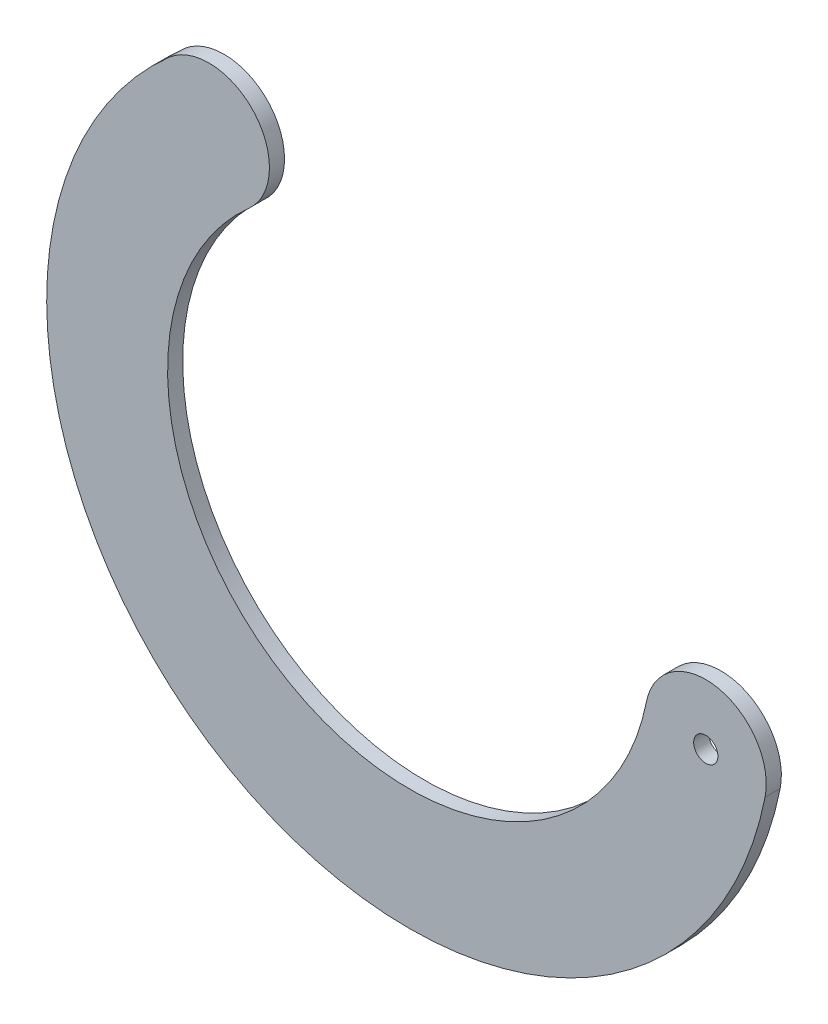
ISO-10303-21;
HEADER;
FILE_DESCRIPTION(('STEP AP214'),'2;1');
FILE_NAME('part.step','',(''),(''),'','','');
FILE_SCHEMA(('AUTOMOTIVE_DESIGN { 1 0 10303 214 1 1 1 1 }'));
ENDSEC;
DATA;
#1=APPLICATION_CONTEXT('core data for automotive mechanical design processes');
#2=APPLICATION_PROTOCOL_DEFINITION('international standard','automotive_design',2000,#1);
#3=PRODUCT_CONTEXT('',#1,'mechanical');
#4=PRODUCT('Part','Part','',(#3));
#5=PRODUCT_RELATED_PRODUCT_CATEGORY('part','',(#4));
#6=PRODUCT_DEFINITION_FORMATION('','',#4);
#7=PRODUCT_DEFINITION_CONTEXT('part definition',#1,'design');
#8=PRODUCT_DEFINITION('design','',#6,#7);
#9=PRODUCT_DEFINITION_SHAPE('','',#8);
#10=(LENGTH_UNIT() NAMED_UNIT(*) SI_UNIT(.MILLI.,.METRE.));
#11=(NAMED_UNIT(*) PLANE_ANGLE_UNIT() SI_UNIT($,.RADIAN.));
#12=(NAMED_UNIT(*) SI_UNIT($,.STERADIAN.) SOLID_ANGLE_UNIT());
#13=UNCERTAINTY_MEASURE_WITH_UNIT(LENGTH_MEASURE(1.E-05),#10,'distance_accuracy_value','');
#14=(GEOMETRIC_REPRESENTATION_CONTEXT(3) GLOBAL_UNCERTAINTY_ASSIGNED_CONTEXT((#13)) GLOBAL_UNIT_ASSIGNED_CONTEXT((#10,
#11,#12)) REPRESENTATION_CONTEXT('',''));
#15=CARTESIAN_POINT('',(0.,0.,0.));
#16=DIRECTION('',(0.,0.,1.));
#17=DIRECTION('',(1.,0.,0.));
#18=AXIS2_PLACEMENT_3D('',#15,#16,#17);
#19=CARTESIAN_POINT('',(-42.1070423614083,47.531536726415,3.175));
#20=DIRECTION('',(0.,0.,-1.));
#21=DIRECTION('',(-1.,0.,0.));
#22=AXIS2_PLACEMENT_3D('',#19,#20,#21);
#23=CYLINDRICAL_SURFACE('',#22,12.7);
#24=CARTESIAN_POINT('',(-42.1070423614083,47.531536726415,0.));
#25=DIRECTION('',(0.,0.,1.));
#26=DIRECTION('',(-1.,0.,0.));
#27=AXIS2_PLACEMENT_3D('',#24,#25,#26);
#28=CIRCLE('',#27,12.7);
#29=CARTESIAN_POINT('',(-33.6856338891268,38.0252293811322,0.));
#30=VERTEX_POINT('',#29);
#31=CARTESIAN_POINT('',(-50.5284508336901,57.0378440716983,0.));
#32=VERTEX_POINT('',#31);
#33=EDGE_CURVE('E106',#30,#32,#28,.T.);
#34=ORIENTED_EDGE('',*,*,#33,.T.);
#35=DIRECTION('',(0.,0.,-1.));
#36=VECTOR('',#35,1.);
#37=CARTESIAN_POINT('',(-50.5284508336901,57.0378440716983,3.175));
#38=LINE('',#37,#36);
#39=CARTESIAN_POINT('',(-50.5284508336901,57.0378440716983,3.175));
#40=VERTEX_POINT('',#39);
#41=EDGE_CURVE('E11',#40,#32,#38,.T.);
#42=ORIENTED_EDGE('',*,*,#41,.F.);
#43=CARTESIAN_POINT('',(-42.1070423614083,47.531536726415,3.175));
#44=DIRECTION('',(0.,0.,1.));
#45=DIRECTION('',(-1.,0.,0.));
#46=AXIS2_PLACEMENT_3D('',#43,#44,#45);
#47=CIRCLE('',#46,12.7);
#48=CARTESIAN_POINT('',(-33.6856338891268,38.0252293811322,3.175));
#49=VERTEX_POINT('',#48);
#50=EDGE_CURVE('E94',#49,#40,#47,.T.);
#51=ORIENTED_EDGE('',*,*,#50,.F.);
#52=DIRECTION('',(0.,0.,-1.));
#53=VECTOR('',#52,1.);
#54=CARTESIAN_POINT('',(-33.6856338891268,38.0252293811322,3.175));
#55=LINE('',#54,#53);
#56=EDGE_CURVE('E102',#49,#30,#55,.T.);
#57=ORIENTED_EDGE('',*,*,#56,.T.);
#58=EDGE_LOOP('',(#34,#42,#51,#57));
#59=FACE_BOUND('',#58,.T.);
#60=ADVANCED_FACE('F43',(#59),#23,.T.);
#61=CARTESIAN_POINT('',(0.,0.,3.175));
#62=DIRECTION('',(0.,0.,-1.));
#63=DIRECTION('',(-1.,0.,0.));
#64=AXIS2_PLACEMENT_3D('',#61,#62,#63);
#65=CYLINDRICAL_SURFACE('',#64,76.2);
#66=CARTESIAN_POINT('',(0.,0.,0.));
#67=DIRECTION('',(0.,0.,1.));
#68=DIRECTION('',(1.,0.,0.));
#69=AXIS2_PLACEMENT_3D('',#66,#67,#68);
#70=CIRCLE('',#69,76.2);
#71=CARTESIAN_POINT('',(74.7202474876482,-14.9440494975296,0.));
#72=VERTEX_POINT('',#71);
#73=EDGE_CURVE('E98',#32,#72,#70,.T.);
#74=ORIENTED_EDGE('',*,*,#73,.T.);
#75=DIRECTION('',(0.,0.,-1.));
#76=VECTOR('',#75,1.);
#77=CARTESIAN_POINT('',(74.7202474876482,-14.9440494975296,3.175));
#78=LINE('',#77,#76);
#79=CARTESIAN_POINT('',(74.7202474876482,-14.9440494975296,3.175));
#80=VERTEX_POINT('',#79);
#81=EDGE_CURVE('E51',#80,#72,#78,.T.);
#82=ORIENTED_EDGE('',*,*,#81,.F.);
#83=CARTESIAN_POINT('',(0.,0.,3.175));
#84=DIRECTION('',(0.,0.,1.));
#85=DIRECTION('',(1.,0.,0.));
#86=AXIS2_PLACEMENT_3D('',#83,#84,#85);
#87=CIRCLE('',#86,76.2);
#88=EDGE_CURVE('E89',#40,#80,#87,.T.);
#89=ORIENTED_EDGE('',*,*,#88,.F.);
#90=ORIENTED_EDGE('',*,*,#41,.T.);
#91=EDGE_LOOP('',(#74,#82,#89,#90));
#92=FACE_BOUND('',#91,.T.);
#93=ADVANCED_FACE('F97',(#92),#65,.T.);
#94=CARTESIAN_POINT('',(62.2668729063735,-12.4533745812747,3.175));
#95=DIRECTION('',(0.,0.,-1.));
#96=DIRECTION('',(-1.,0.,0.));
#97=AXIS2_PLACEMENT_3D('',#94,#95,#96);
#98=CYLINDRICAL_SURFACE('',#97,12.7);
#99=CARTESIAN_POINT('',(62.2668729063735,-12.4533745812747,0.));
#100=DIRECTION('',(0.,0.,1.));
#101=DIRECTION('',(-1.,0.,0.));
#102=AXIS2_PLACEMENT_3D('',#99,#100,#101);
#103=CIRCLE('',#102,12.7);
#104=CARTESIAN_POINT('',(49.8134983250988,-9.96269966501976,0.));
#105=VERTEX_POINT('',#104);
#106=EDGE_CURVE('E76',#72,#105,#103,.T.);
#107=ORIENTED_EDGE('',*,*,#106,.T.);
#108=DIRECTION('',(0.,0.,-1.));
#109=VECTOR('',#108,1.);
#110=CARTESIAN_POINT('',(49.8134983250988,-9.96269966501976,3.175));
#111=LINE('',#110,#109);
#112=CARTESIAN_POINT('',(49.8134983250988,-9.96269966501976,3.175));
#113=VERTEX_POINT('',#112);
#114=EDGE_CURVE('E99',#113,#105,#111,.T.);
#115=ORIENTED_EDGE('',*,*,#114,.F.);
#116=CARTESIAN_POINT('',(62.2668729063735,-12.4533745812747,3.175));
#117=DIRECTION('',(0.,0.,1.));
#118=DIRECTION('',(-1.,0.,0.));
#119=AXIS2_PLACEMENT_3D('',#116,#117,#118);
#120=CIRCLE('',#119,12.7);
#121=EDGE_CURVE('E92',#80,#113,#120,.T.);
#122=ORIENTED_EDGE('',*,*,#121,.F.);
#123=ORIENTED_EDGE('',*,*,#81,.T.);
#124=EDGE_LOOP('',(#107,#115,#122,#123));
#125=FACE_BOUND('',#124,.T.);
#126=ADVANCED_FACE('F100',(#125),#98,.T.);
#127=CARTESIAN_POINT('',(0.,0.,3.175));
#128=DIRECTION('',(0.,0.,-1.));
#129=DIRECTION('',(-1.,0.,0.));
#130=AXIS2_PLACEMENT_3D('',#127,#128,#129);
#131=CYLINDRICAL_SURFACE('',#130,50.8000000000001);
#132=CARTESIAN_POINT('',(0.,0.,0.));
#133=DIRECTION('',(0.,0.,-1.));
#134=DIRECTION('',(1.,0.,0.));
#135=AXIS2_PLACEMENT_3D('',#132,#133,#134);
#136=CIRCLE('',#135,50.8000000000001);
#137=EDGE_CURVE('E82',#105,#30,#136,.T.);
#138=ORIENTED_EDGE('',*,*,#137,.T.);
#139=ORIENTED_EDGE('',*,*,#56,.F.);
#140=CARTESIAN_POINT('',(0.,0.,3.175));
#141=DIRECTION('',(0.,0.,-1.));
#142=DIRECTION('',(1.,0.,0.));
#143=AXIS2_PLACEMENT_3D('',#140,#141,#142);
#144=CIRCLE('',#143,50.8000000000001);
#145=EDGE_CURVE('E59',#113,#49,#144,.T.);
#146=ORIENTED_EDGE('',*,*,#145,.F.);
#147=ORIENTED_EDGE('',*,*,#114,.T.);
#148=EDGE_LOOP('',(#138,#139,#146,#147));
#149=FACE_BOUND('',#148,.T.);
#150=ADVANCED_FACE('F114',(#149),#131,.F.);
#151=CARTESIAN_POINT('',(-21.0535211807041,23.7657683632075,3.175));
#152=DIRECTION('',(0.,0.,-1.));
#153=DIRECTION('',(-1.,0.,0.));
#154=AXIS2_PLACEMENT_3D('',#151,#152,#153);
#155=PLANE('',#154);
#156=CARTESIAN_POINT('',(62.2668729063735,-12.4533745812747,3.175));
#157=DIRECTION('',(0.,0.,1.));
#158=DIRECTION('',(1.,0.,0.));
#159=AXIS2_PLACEMENT_3D('',#156,#157,#158);
#160=CIRCLE('',#159,2.55269999999999);
#161=CARTESIAN_POINT('',(64.8195729063734,-12.4533745812747,3.175));
#162=VERTEX_POINT('',#161);
#163=EDGE_CURVE('E122',#162,#162,#160,.T.);
#164=ORIENTED_EDGE('',*,*,#163,.F.);
#165=EDGE_LOOP('',(#164));
#166=FACE_BOUND('',#165,.T.);
#167=ORIENTED_EDGE('',*,*,#50,.T.);
#168=ORIENTED_EDGE('',*,*,#88,.T.);
#169=ORIENTED_EDGE('',*,*,#121,.T.);
#170=ORIENTED_EDGE('',*,*,#145,.T.);
#171=EDGE_LOOP('',(#167,#168,#169,#170));
#172=FACE_BOUND('',#171,.T.);
#173=ADVANCED_FACE('F90',(#166,#172),#155,.F.);
#174=CARTESIAN_POINT('',(-21.0535211807041,23.7657683632075,0.));
#175=DIRECTION('',(0.,0.,-1.));
#176=DIRECTION('',(-1.,0.,0.));
#177=AXIS2_PLACEMENT_3D('',#174,#175,#176);
#178=PLANE('',#177);
#179=CARTESIAN_POINT('',(62.2668729063735,-12.4533745812747,0.));
#180=DIRECTION('',(0.,0.,1.));
#181=DIRECTION('',(1.,0.,0.));
#182=AXIS2_PLACEMENT_3D('',#179,#180,#181);
#183=CIRCLE('',#182,2.55269999999999);
#184=CARTESIAN_POINT('',(64.8195729063734,-12.4533745812747,0.));
#185=VERTEX_POINT('',#184);
#186=EDGE_CURVE('E109',#185,#185,#183,.T.);
#187=ORIENTED_EDGE('',*,*,#186,.T.);
#188=EDGE_LOOP('',(#187));
#189=FACE_BOUND('',#188,.T.);
#190=ORIENTED_EDGE('',*,*,#33,.F.);
#191=ORIENTED_EDGE('',*,*,#137,.F.);
#192=ORIENTED_EDGE('',*,*,#106,.F.);
#193=ORIENTED_EDGE('',*,*,#73,.F.);
#194=EDGE_LOOP('',(#190,#191,#192,#193));
#195=FACE_BOUND('',#194,.T.);
#196=ADVANCED_FACE('F117',(#189,#195),#178,.T.);
#197=CARTESIAN_POINT('',(62.2668729063735,-12.4533745812747,3.175));
#198=DIRECTION('',(0.,0.,1.));
#199=DIRECTION('',(1.,0.,0.));
#200=AXIS2_PLACEMENT_3D('',#197,#198,#199);
#201=CYLINDRICAL_SURFACE('',#200,2.55269999999999);
#202=ORIENTED_EDGE('',*,*,#186,.F.);
#203=EDGE_LOOP('',(#202));
#204=FACE_BOUND('',#203,.T.);
#205=ORIENTED_EDGE('',*,*,#163,.T.);
#206=EDGE_LOOP('',(#205));
#207=FACE_BOUND('',#206,.T.);
#208=ADVANCED_FACE('F126',(#204,#207),#201,.F.);
#209=CLOSED_SHELL('',(#60,#93,#126,#150,#173,#196,#208));
#210=MANIFOLD_SOLID_BREP('B2',#209);
#211=ADVANCED_BREP_SHAPE_REPRESENTATION('',(#18,#210),#14);
#212=SHAPE_DEFINITION_REPRESENTATION(#9,#211);
ENDSEC;
END-ISO-10303-21;
